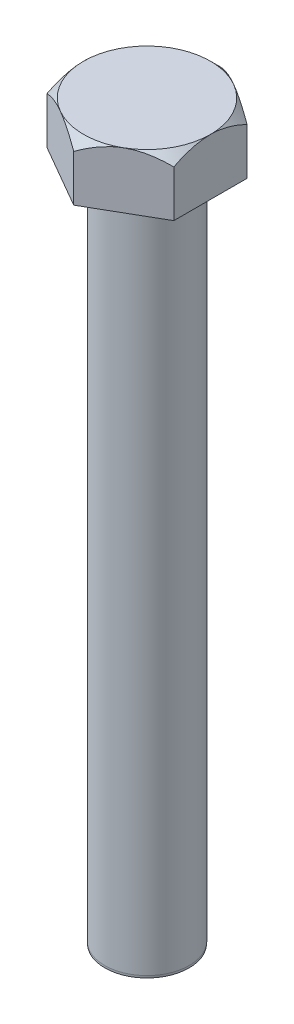
ISO-10303-21;
HEADER;
FILE_DESCRIPTION(('STEP AP214'),'2;1');
FILE_NAME('part.step','',(''),(''),'','','');
FILE_SCHEMA(('AUTOMOTIVE_DESIGN { 1 0 10303 214 1 1 1 1 }'));
ENDSEC;
DATA;
#1=APPLICATION_CONTEXT('core data for automotive mechanical design processes');
#2=APPLICATION_PROTOCOL_DEFINITION('international standard','automotive_design',2000,#1);
#3=PRODUCT_CONTEXT('',#1,'mechanical');
#4=PRODUCT('Part','Part','',(#3));
#5=PRODUCT_RELATED_PRODUCT_CATEGORY('part','',(#4));
#6=PRODUCT_DEFINITION_FORMATION('','',#4);
#7=PRODUCT_DEFINITION_CONTEXT('part definition',#1,'design');
#8=PRODUCT_DEFINITION('design','',#6,#7);
#9=PRODUCT_DEFINITION_SHAPE('','',#8);
#10=(LENGTH_UNIT() NAMED_UNIT(*) SI_UNIT(.MILLI.,.METRE.));
#11=(NAMED_UNIT(*) PLANE_ANGLE_UNIT() SI_UNIT($,.RADIAN.));
#12=(NAMED_UNIT(*) SI_UNIT($,.STERADIAN.) SOLID_ANGLE_UNIT());
#13=UNCERTAINTY_MEASURE_WITH_UNIT(LENGTH_MEASURE(1.E-05),#10,'distance_accuracy_value','');
#14=(GEOMETRIC_REPRESENTATION_CONTEXT(3) GLOBAL_UNCERTAINTY_ASSIGNED_CONTEXT((#13)) GLOBAL_UNIT_ASSIGNED_CONTEXT((#10,
#11,#12)) REPRESENTATION_CONTEXT('',''));
#15=CARTESIAN_POINT('',(0.,0.,0.));
#16=DIRECTION('',(0.,0.,1.));
#17=DIRECTION('',(1.,0.,0.));
#18=AXIS2_PLACEMENT_3D('',#15,#16,#17);
#19=CARTESIAN_POINT('',(7.15009999999996,6.35,-4.12811215973283));
#20=DIRECTION('',(-0.499999999999995,0.,0.866025403784441));
#21=DIRECTION('',(0.866025403784442,0.,0.499999999999995));
#22=AXIS2_PLACEMENT_3D('',#19,#20,#21);
#23=PLANE('',#22);
#24=CARTESIAN_POINT('',(7.15029999999996,5.24376020805829,-4.12799668967899));
#25=CARTESIAN_POINT('',(7.02735981479973,5.31473208114426,-4.19897623869856));
#26=CARTESIAN_POINT('',(6.90347465758507,5.38352591509957,-4.27050136756504));
#27=CARTESIAN_POINT('',(6.65362901516201,5.51609496244518,-4.41474981647385));
#28=CARTESIAN_POINT('',(6.52766744128796,5.57986743492815,-4.48747376505758));
#29=CARTESIAN_POINT('',(6.14521985336649,5.76320280111308,-4.70827998289497));
#30=CARTESIAN_POINT('',(5.88549626774101,5.87400155292641,-4.85823146497073));
#31=CARTESIAN_POINT('',(5.36174291484116,6.06373669034418,-5.16062060425642));
#32=CARTESIAN_POINT('',(5.09784700922402,6.14315107326227,-5.31298097640252));
#33=CARTESIAN_POINT('',(4.69766469893423,6.23501393674774,-5.54402634097325));
#34=CARTESIAN_POINT('',(4.56368142899528,6.26107948825729,-5.62138161793941));
#35=CARTESIAN_POINT('',(4.29458046497126,6.30353452510466,-5.77674713195786));
#36=CARTESIAN_POINT('',(4.15946294347778,6.319925456437,-5.85475726936435));
#37=CARTESIAN_POINT('',(3.83019852397778,6.34740730224126,-6.04485817059725));
#38=CARTESIAN_POINT('',(3.63569685436158,6.35317340265754,-6.15715376190799));
#39=CARTESIAN_POINT('',(3.24704409240871,6.34349459202812,-6.38154253864277));
#40=CARTESIAN_POINT('',(3.05289314684432,6.32804224579773,-6.49363563932778));
#41=CARTESIAN_POINT('',(2.66642169813378,6.27683739902505,-6.71676503427492));
#42=CARTESIAN_POINT('',(2.47410348685935,6.24106219749936,-6.82780000532428));
#43=CARTESIAN_POINT('',(2.09277255135678,6.15115660179108,-7.04796152358701));
#44=CARTESIAN_POINT('',(1.90375957482909,6.09702761510223,-7.15708821646561));
#45=CARTESIAN_POINT('',(1.56823093998172,5.98566881448239,-7.35080576411556));
#46=CARTESIAN_POINT('',(1.42097225552798,5.93136793728872,-7.43582560522543));
#47=CARTESIAN_POINT('',(1.12909829468736,5.81401595028394,-7.6043391150862));
#48=CARTESIAN_POINT('',(0.984483098549458,5.75096457532957,-7.68783273750533));
#49=CARTESIAN_POINT('',(0.6983516080155,5.61752492778284,-7.85303083058874));
#50=CARTESIAN_POINT('',(0.55682717595113,5.54715972840591,-7.93473999953801));
#51=CARTESIAN_POINT('',(0.276398890261677,5.40001620595466,-8.0966453457692));
#52=CARTESIAN_POINT('',(0.137493492810105,5.32324181558632,-8.17684241437976));
#53=CARTESIAN_POINT('',(-0.000199999999999894,5.24376020805829,-8.25633978951933));
#54=B_SPLINE_CURVE_WITH_KNOTS('',3,(#24,#25,#26,#27,#28,#29,#30,#31,#32,#33,#34,#35,#36,#37,#38,
#39,#40,#41,#42,#43,#44,#45,#46,#47,#48,#49,#50,#51,#52,#53),.UNSPECIFIED.,.F.,.F.,(4,2,2,2,2,2,
2,2,2,2,2,2,2,2,4),(0.,0.476107132166216,0.952472371030046,1.91034566100054,2.85300915505907,
3.32341643946382,3.7937533977268,4.46670173744884,5.13988594609707,5.81382359601269,
6.48770957546597,7.02295690652281,7.55822045931063,8.09184389327706,8.6251422671035),.UNSPECIFIED.);
#55=CARTESIAN_POINT('',(7.15009999999996,5.24387568053451,-4.12811215973283));
#56=VERTEX_POINT('',#55);
#57=CARTESIAN_POINT('',(3.57504999999996,6.35,-6.19216823959914));
#58=VERTEX_POINT('',#57);
#59=EDGE_CURVE('E105',#56,#58,#54,.T.);
#60=ORIENTED_EDGE('',*,*,#59,.F.);
#61=DIRECTION('',(0.,-1.,0.));
#62=VECTOR('',#61,1.);
#63=CARTESIAN_POINT('',(7.15009999999996,6.35,-4.12811215973283));
#64=LINE('',#63,#62);
#65=CARTESIAN_POINT('',(7.15009999999996,0.,-4.12811215973283));
#66=VERTEX_POINT('',#65);
#67=EDGE_CURVE('E272',#56,#66,#64,.T.);
#68=ORIENTED_EDGE('',*,*,#67,.T.);
#69=DIRECTION('',(-0.866025403784441,0.,-0.499999999999995));
#70=VECTOR('',#69,1.);
#71=CARTESIAN_POINT('',(7.15009999999996,0.,-4.12811215973283));
#72=LINE('',#71,#70);
#73=CARTESIAN_POINT('',(0.,0.,-8.25622431946549));
#74=VERTEX_POINT('',#73);
#75=EDGE_CURVE('E114',#66,#74,#72,.T.);
#76=ORIENTED_EDGE('',*,*,#75,.T.);
#77=DIRECTION('',(0.,-1.,0.));
#78=VECTOR('',#77,1.);
#79=CARTESIAN_POINT('',(0.,6.35,-8.25622431946549));
#80=LINE('',#79,#78);
#81=CARTESIAN_POINT('',(0.,5.24387568053451,-8.25622431946549));
#82=VERTEX_POINT('',#81);
#83=EDGE_CURVE('E132',#82,#74,#80,.T.);
#84=ORIENTED_EDGE('',*,*,#83,.F.);
#85=EDGE_CURVE('E115',#58,#82,#54,.T.);
#86=ORIENTED_EDGE('',*,*,#85,.F.);
#87=EDGE_LOOP('',(#60,#68,#76,#84,#86));
#88=FACE_BOUND('',#87,.T.);
#89=ADVANCED_FACE('F35',(#88),#23,.F.);
#90=CARTESIAN_POINT('',(0.,6.35,-8.25622431946549));
#91=DIRECTION('',(0.500000000000001,0.,0.866025403784438));
#92=DIRECTION('',(0.866025403784438,0.,-0.500000000000001));
#93=AXIS2_PLACEMENT_3D('',#90,#91,#92);
#94=PLANE('',#93);
#95=CARTESIAN_POINT('',(0.0002,5.24376020805829,-8.25633978951933));
#96=CARTESIAN_POINT('',(-0.122740185200222,5.31473208114426,-8.18536024049976));
#97=CARTESIAN_POINT('',(-0.246625342414885,5.38352591509958,-8.11383511163327));
#98=CARTESIAN_POINT('',(-0.496470984837945,5.51609496244519,-7.96958666272447));
#99=CARTESIAN_POINT('',(-0.622432558711996,5.57986743492816,-7.89686271414073));
#100=CARTESIAN_POINT('',(-1.00488014663348,5.76320280111309,-7.67605649630334));
#101=CARTESIAN_POINT('',(-1.26460373225895,5.87400155292642,-7.52610501422758));
#102=CARTESIAN_POINT('',(-1.78835708515881,6.06373669034419,-7.22371587494188));
#103=CARTESIAN_POINT('',(-2.05225299077595,6.1431510732623,-7.07135550279578));
#104=CARTESIAN_POINT('',(-2.45243530106574,6.23501393674777,-6.84031013822504));
#105=CARTESIAN_POINT('',(-2.58641857100469,6.26107948825732,-6.76295486125888));
#106=CARTESIAN_POINT('',(-2.85551953502872,6.30353452510469,-6.60758934724042));
#107=CARTESIAN_POINT('',(-2.99063705652219,6.31992545643702,-6.52957920983393));
#108=CARTESIAN_POINT('',(-3.3199014760222,6.34740730224129,-6.33947830860103));
#109=CARTESIAN_POINT('',(-3.51440314563839,6.35317340265757,-6.22718271729029));
#110=CARTESIAN_POINT('',(-3.90305590759126,6.34349459202815,-6.00279394055551));
#111=CARTESIAN_POINT('',(-4.09720685315564,6.32804224579776,-5.89070083987049));
#112=CARTESIAN_POINT('',(-4.48367830186619,6.27683739902508,-5.66757144492336));
#113=CARTESIAN_POINT('',(-4.67599651314062,6.24106219749939,-5.556536473874));
#114=CARTESIAN_POINT('',(-5.05732744864318,6.15115660179112,-5.33637495561126));
#115=CARTESIAN_POINT('',(-5.24634042517087,6.09702761510226,-5.22724826273266));
#116=CARTESIAN_POINT('',(-5.58186906001824,5.98566881448243,-5.03353071508271));
#117=CARTESIAN_POINT('',(-5.72912774447198,5.93136793728875,-4.94851087397283));
#118=CARTESIAN_POINT('',(-6.02100170531261,5.81401595028396,-4.77999736411205));
#119=CARTESIAN_POINT('',(-6.16561690145052,5.7509645753296,-4.69650374169292));
#120=CARTESIAN_POINT('',(-6.45174839198449,5.61752492778286,-4.5313056486095));
#121=CARTESIAN_POINT('',(-6.59327282404887,5.54715972840593,-4.44959647966022));
#122=CARTESIAN_POINT('',(-6.87370110973833,5.40001620595466,-4.28769113342903));
#123=CARTESIAN_POINT('',(-7.0126065071899,5.32324181558632,-4.20749406481847));
#124=CARTESIAN_POINT('',(-7.15030000000001,5.24376020805829,-4.12799668967889));
#125=B_SPLINE_CURVE_WITH_KNOTS('',3,(#95,#96,#97,#98,#99,#100,#101,#102,#103,#104,#105,#106,
#107,#108,#109,#110,#111,#112,#113,#114,#115,#116,#117,#118,#119,#120,#121,#122,#123,#124),
.UNSPECIFIED.,.F.,.F.,(4,2,2,2,2,2,2,2,2,2,2,2,2,2,4),(0.,0.476107132166221,0.952472371030056,
1.91034566100056,2.85300915505911,3.32341643946385,3.79375339772684,4.46670173744889,
5.13988594609711,5.81382359601273,6.48770957546601,7.02295690652286,7.55822045931071,
8.09184389327715,8.62514226710361),.UNSPECIFIED.);
#126=CARTESIAN_POINT('',(-3.57505000000001,6.35,-6.19216823959911));
#127=VERTEX_POINT('',#126);
#128=EDGE_CURVE('E122',#82,#127,#125,.T.);
#129=ORIENTED_EDGE('',*,*,#128,.F.);
#130=ORIENTED_EDGE('',*,*,#83,.T.);
#131=DIRECTION('',(-0.866025403784438,0.,0.500000000000001));
#132=VECTOR('',#131,1.);
#133=CARTESIAN_POINT('',(0.,0.,-8.25622431946549));
#134=LINE('',#133,#132);
#135=CARTESIAN_POINT('',(-7.15010000000001,0.,-4.12811215973273));
#136=VERTEX_POINT('',#135);
#137=EDGE_CURVE('E263',#74,#136,#134,.T.);
#138=ORIENTED_EDGE('',*,*,#137,.T.);
#139=DIRECTION('',(0.,-1.,0.));
#140=VECTOR('',#139,1.);
#141=CARTESIAN_POINT('',(-7.15010000000001,6.35,-4.12811215973273));
#142=LINE('',#141,#140);
#143=CARTESIAN_POINT('',(-7.15010000000001,5.24387568053451,-4.12811215973273));
#144=VERTEX_POINT('',#143);
#145=EDGE_CURVE('E205',#144,#136,#142,.T.);
#146=ORIENTED_EDGE('',*,*,#145,.F.);
#147=EDGE_CURVE('E133',#127,#144,#125,.T.);
#148=ORIENTED_EDGE('',*,*,#147,.F.);
#149=EDGE_LOOP('',(#129,#130,#138,#146,#148));
#150=FACE_BOUND('',#149,.T.);
#151=ADVANCED_FACE('F193',(#150),#94,.F.);
#152=CARTESIAN_POINT('',(-7.15010000000001,6.35,-4.12811215973273));
#153=DIRECTION('',(1.,0.,0.));
#154=DIRECTION('',(0.,0.,-1.));
#155=AXIS2_PLACEMENT_3D('',#152,#153,#154);
#156=PLANE('',#155);
#157=CARTESIAN_POINT('',(-7.15010000000003,1.63089085788719,-9.47386909605649));
#158=CARTESIAN_POINT('',(-7.15010000000003,1.81121581560539,-9.24790249070521));
#159=CARTESIAN_POINT('',(-7.15010000000003,1.99016418725543,-9.02082114931031));
#160=CARTESIAN_POINT('',(-7.15010000000003,2.34465316669975,-8.56394073706759));
#161=CARTESIAN_POINT('',(-7.15010000000003,2.5201930563962,-8.33414110959574));
#162=CARTESIAN_POINT('',(-7.15010000000003,2.868446395647,-7.86968034981608));
#163=CARTESIAN_POINT('',(-7.15010000000003,3.0411284373893,-7.63499559658916));
#164=CARTESIAN_POINT('',(-7.15010000000002,3.38131039804522,-7.16191403046406));
#165=CARTESIAN_POINT('',(-7.15010000000002,3.54881066036877,-6.92351746513816));
#166=CARTESIAN_POINT('',(-7.15010000000002,3.89019859321875,-6.42356671095031));
#167=CARTESIAN_POINT('',(-7.15010000000002,4.06356649358224,-6.16165586234294));
#168=CARTESIAN_POINT('',(-7.15010000000002,4.40077381694092,-5.63166319550724));
#169=CARTESIAN_POINT('',(-7.15010000000002,4.56461143837196,-5.36358022380933));
#170=CARTESIAN_POINT('',(-7.15010000000002,4.87937516438839,-4.82096243326766));
#171=CARTESIAN_POINT('',(-7.15010000000002,5.03033869234989,-4.54644949317194));
#172=CARTESIAN_POINT('',(-7.15010000000001,5.31597281014485,-3.98913965325442));
#173=CARTESIAN_POINT('',(-7.15010000000001,5.45065169434768,-3.70634706251455));
#174=CARTESIAN_POINT('',(-7.15010000000001,5.68224395499392,-3.16946720873966));
#175=CARTESIAN_POINT('',(-7.15010000000001,5.78179628197522,-2.91652981738955));
#176=CARTESIAN_POINT('',(-7.15010000000001,5.96068130805078,-2.40346766112692));
#177=CARTESIAN_POINT('',(-7.15010000000001,6.04001286165642,-2.14334248995796));
#178=CARTESIAN_POINT('',(-7.1501,6.17245096820923,-1.62248495464225));
#179=CARTESIAN_POINT('',(-7.1501,6.22609680418521,-1.36189223637387));
#180=CARTESIAN_POINT('',(-7.1501,6.30590762943054,-0.836507861915944));
#181=CARTESIAN_POINT('',(-7.1501,6.33208104018206,-0.571717517759924));
#182=CARTESIAN_POINT('',(-7.1501,6.35408284405149,-0.0577187353176461));
#183=CARTESIAN_POINT('',(-7.1501,6.35173239837544,0.19141159314656));
#184=CARTESIAN_POINT('',(-7.1501,6.32124800606946,0.688077635906895));
#185=CARTESIAN_POINT('',(-7.1501,6.29311214694111,0.935613230550542));
#186=CARTESIAN_POINT('',(-7.15009999999999,6.21229082442829,1.43154670462864));
#187=CARTESIAN_POINT('',(-7.15009999999999,6.15913527095504,1.6798664946589));
#188=CARTESIAN_POINT('',(-7.15009999999999,6.03147971556139,2.17085918647798));
#189=CARTESIAN_POINT('',(-7.15009999999999,5.9569795257941,2.4135320385497));
#190=CARTESIAN_POINT('',(-7.15009999999999,5.79048248965085,2.89215321636684));
#191=CARTESIAN_POINT('',(-7.15009999999999,5.69852189244993,3.12811432942166));
#192=CARTESIAN_POINT('',(-7.15009999999999,5.50032506783947,3.59401612680425));
#193=CARTESIAN_POINT('',(-7.15009999999999,5.39408271156479,3.8239541754974));
#194=CARTESIAN_POINT('',(-7.15009999999998,5.16984050461004,4.27885242834733));
#195=CARTESIAN_POINT('',(-7.15009999999998,5.05180562125056,4.50379521875785));
#196=CARTESIAN_POINT('',(-7.15009999999998,4.80656023664318,4.94854616944678));
#197=CARTESIAN_POINT('',(-7.15009999999998,4.67935108776111,5.168355080205));
#198=CARTESIAN_POINT('',(-7.15009999999998,4.42401096856745,5.59273981639913));
#199=CARTESIAN_POINT('',(-7.15009999999998,4.29623669089792,5.79753139755686));
#200=CARTESIAN_POINT('',(-7.15009999999998,4.03519862932643,6.20359582585859));
#201=CARTESIAN_POINT('',(-7.15009999999998,3.90193444245225,6.4048684131501));
#202=CARTESIAN_POINT('',(-7.15009999999998,3.63195773249821,6.80275896707806));
#203=CARTESIAN_POINT('',(-7.15009999999998,3.49528075722348,6.9994011408559));
#204=CARTESIAN_POINT('',(-7.15009999999997,3.21822330604325,7.38998078224734));
#205=CARTESIAN_POINT('',(-7.15009999999997,3.0778438588743,7.58391897874123));
#206=CARTESIAN_POINT('',(-7.15009999999997,2.93594735354651,7.77672110388246));
#207=B_SPLINE_CURVE_WITH_KNOTS('',3,(#157,#158,#159,#160,#161,#162,#163,#164,#165,#166,#167,
#168,#169,#170,#171,#172,#173,#174,#175,#176,#177,#178,#179,#180,#181,#182,#183,#184,#185,#186,
#187,#188,#189,#190,#191,#192,#193,#194,#195,#196,#197,#198,#199,#200,#201,#202,#203,#204,#205,
#206),.UNSPECIFIED.,.F.,.F.,(4,2,2,2,2,2,2,2,2,2,2,2,2,2,2,2,2,2,2,2,2,2,2,2,4),(0.,
0.867309176171177,1.73479913643537,2.60884845848508,3.48283973039317,4.42495432930787,
5.36724644671029,6.30669878036595,7.24567058249782,8.06046150623437,8.87529857688988,
9.67218308312768,10.4688232385201,11.214882925787,11.9609979526155,12.7217281313764,
13.4824650052708,14.2416394652586,15.0011407631884,15.7629695239043,16.524686213128,
17.248733545678,17.9728341200296,18.6912157430264,19.4093998229271),.UNSPECIFIED.);
#208=CARTESIAN_POINT('',(-7.1501,6.35,0.));
#209=VERTEX_POINT('',#208);
#210=EDGE_CURVE('E187',#144,#209,#207,.T.);
#211=ORIENTED_EDGE('',*,*,#210,.F.);
#212=ORIENTED_EDGE('',*,*,#145,.T.);
#213=DIRECTION('',(0.,0.,1.));
#214=VECTOR('',#213,1.);
#215=CARTESIAN_POINT('',(-7.15010000000001,0.,-4.12811215973273));
#216=LINE('',#215,#214);
#217=CARTESIAN_POINT('',(-7.15009999999999,0.,4.12811215973278));
#218=VERTEX_POINT('',#217);
#219=EDGE_CURVE('E222',#136,#218,#216,.T.);
#220=ORIENTED_EDGE('',*,*,#219,.T.);
#221=DIRECTION('',(0.,-1.,0.));
#222=VECTOR('',#221,1.);
#223=CARTESIAN_POINT('',(-7.15009999999999,6.35,4.12811215973278));
#224=LINE('',#223,#222);
#225=CARTESIAN_POINT('',(-7.15009999999999,5.24387568053451,4.12811215973278));
#226=VERTEX_POINT('',#225);
#227=EDGE_CURVE('E220',#226,#218,#224,.T.);
#228=ORIENTED_EDGE('',*,*,#227,.F.);
#229=EDGE_CURVE('E181',#209,#226,#207,.T.);
#230=ORIENTED_EDGE('',*,*,#229,.F.);
#231=EDGE_LOOP('',(#211,#212,#220,#228,#230));
#232=FACE_BOUND('',#231,.T.);
#233=ADVANCED_FACE('F189',(#232),#156,.F.);
#234=CARTESIAN_POINT('',(-7.15009999999999,6.35,4.12811215973278));
#235=DIRECTION('',(0.499999999999995,0.,-0.866025403784441));
#236=DIRECTION('',(-0.866025403784441,0.,-0.499999999999995));
#237=AXIS2_PLACEMENT_3D('',#234,#235,#236);
#238=PLANE('',#237);
#239=CARTESIAN_POINT('',(-7.15029999999998,5.24376020805829,4.12799668967894));
#240=CARTESIAN_POINT('',(-7.02735981479976,5.31473208114426,4.19897623869851));
#241=CARTESIAN_POINT('',(-6.9034746575851,5.38352591509958,4.27050136756499));
#242=CARTESIAN_POINT('',(-6.65362901516204,5.51609496244519,4.4147498164738));
#243=CARTESIAN_POINT('',(-6.52766744128798,5.57986743492816,4.48747376505753));
#244=CARTESIAN_POINT('',(-6.1452198533665,5.76320280111309,4.70827998289492));
#245=CARTESIAN_POINT('',(-5.88549626774103,5.87400155292642,4.85823146497068));
#246=CARTESIAN_POINT('',(-5.36174291484117,6.06373669034419,5.16062060425638));
#247=CARTESIAN_POINT('',(-5.09784700922402,6.1431510732623,5.31298097640248));
#248=CARTESIAN_POINT('',(-4.69766469893423,6.23501393674777,5.54402634097321));
#249=CARTESIAN_POINT('',(-4.56368142899528,6.26107948825732,5.62138161793937));
#250=CARTESIAN_POINT('',(-4.29458046497126,6.30353452510469,5.77674713195783));
#251=CARTESIAN_POINT('',(-4.15946294347778,6.31992545643702,5.85475726936432));
#252=CARTESIAN_POINT('',(-3.83019852397777,6.34740730224129,6.04485817059721));
#253=CARTESIAN_POINT('',(-3.63569685436158,6.35317340265757,6.15715376190795));
#254=CARTESIAN_POINT('',(-3.24704409240871,6.34349459202815,6.38154253864273));
#255=CARTESIAN_POINT('',(-3.05289314684433,6.32804224579776,6.49363563932775));
#256=CARTESIAN_POINT('',(-2.66642169813378,6.27683739902508,6.71676503427488));
#257=CARTESIAN_POINT('',(-2.47410348685935,6.24106219749939,6.82780000532424));
#258=CARTESIAN_POINT('',(-2.09277255135678,6.15115660179112,7.04796152358698));
#259=CARTESIAN_POINT('',(-1.90375957482909,6.09702761510226,7.15708821646557));
#260=CARTESIAN_POINT('',(-1.56823093998172,5.98566881448243,7.35080576411552));
#261=CARTESIAN_POINT('',(-1.42097225552798,5.93136793728875,7.4358256052254));
#262=CARTESIAN_POINT('',(-1.12909829468735,5.81401595028396,7.60433911508618));
#263=CARTESIAN_POINT('',(-0.984483098549436,5.7509645753296,7.68783273750531));
#264=CARTESIAN_POINT('',(-0.698351608015466,5.61752492778286,7.85303083058873));
#265=CARTESIAN_POINT('',(-0.556827175951092,5.54715972840593,7.934739999538));
#266=CARTESIAN_POINT('',(-0.276398890261629,5.40001620595466,8.0966453457692));
#267=CARTESIAN_POINT('',(-0.137493492810052,5.32324181558632,8.17684241437975));
#268=CARTESIAN_POINT('',(0.000200000000057124,5.24376020805829,8.25633978951933));
#269=B_SPLINE_CURVE_WITH_KNOTS('',3,(#239,#240,#241,#242,#243,#244,#245,#246,#247,#248,#249,
#250,#251,#252,#253,#254,#255,#256,#257,#258,#259,#260,#261,#262,#263,#264,#265,#266,#267,#268),
.UNSPECIFIED.,.F.,.F.,(4,2,2,2,2,2,2,2,2,2,2,2,2,2,4),(0.,0.476107132166221,0.952472371030058,
1.91034566100057,2.85300915505911,3.32341643946385,3.79375339772684,4.46670173744888,
5.13988594609711,5.81382359601273,6.48770957546601,7.02295690652286,7.55822045931071,
8.09184389327715,8.62514226710361),.UNSPECIFIED.);
#270=CARTESIAN_POINT('',(-3.57504999999996,6.35,6.19216823959913));
#271=VERTEX_POINT('',#270);
#272=EDGE_CURVE('E188',#226,#271,#269,.T.);
#273=ORIENTED_EDGE('',*,*,#272,.F.);
#274=ORIENTED_EDGE('',*,*,#227,.T.);
#275=DIRECTION('',(0.866025403784441,0.,0.499999999999995));
#276=VECTOR('',#275,1.);
#277=CARTESIAN_POINT('',(-7.15009999999999,0.,4.12811215973278));
#278=LINE('',#277,#276);
#279=CARTESIAN_POINT('',(0.,0.,8.25622431946549));
#280=VERTEX_POINT('',#279);
#281=EDGE_CURVE('E264',#218,#280,#278,.T.);
#282=ORIENTED_EDGE('',*,*,#281,.T.);
#283=DIRECTION('',(0.,-1.,0.));
#284=VECTOR('',#283,1.);
#285=CARTESIAN_POINT('',(0.,6.35,8.25622431946549));
#286=LINE('',#285,#284);
#287=CARTESIAN_POINT('',(0.,5.24387568053451,8.25622431946549));
#288=VERTEX_POINT('',#287);
#289=EDGE_CURVE('E226',#288,#280,#286,.T.);
#290=ORIENTED_EDGE('',*,*,#289,.F.);
#291=EDGE_CURVE('E175',#271,#288,#269,.T.);
#292=ORIENTED_EDGE('',*,*,#291,.F.);
#293=EDGE_LOOP('',(#273,#274,#282,#290,#292));
#294=FACE_BOUND('',#293,.T.);
#295=ADVANCED_FACE('F192',(#294),#238,.F.);
#296=CARTESIAN_POINT('',(0.,6.35,8.25622431946549));
#297=DIRECTION('',(-0.500000000000007,0.,-0.866025403784435));
#298=DIRECTION('',(-0.866025403784435,0.,0.500000000000007));
#299=AXIS2_PLACEMENT_3D('',#296,#297,#298);
#300=PLANE('',#299);
#301=CARTESIAN_POINT('',(-0.000199999999942347,5.24376020805829,8.25633978951933));
#302=CARTESIAN_POINT('',(0.122740185200279,5.31473208114426,8.18536024049976));
#303=CARTESIAN_POINT('',(0.246625342414941,5.38352591509958,8.11383511163327));
#304=CARTESIAN_POINT('',(0.496470984838001,5.51609496244519,7.96958666272446));
#305=CARTESIAN_POINT('',(0.622432558712051,5.57986743492816,7.89686271414073));
#306=CARTESIAN_POINT('',(1.00488014663353,5.76320280111309,7.67605649630334));
#307=CARTESIAN_POINT('',(1.264603732259,5.87400155292642,7.52610501422757));
#308=CARTESIAN_POINT('',(1.78835708515886,6.06373669034419,7.22371587494186));
#309=CARTESIAN_POINT('',(2.052252990776,6.1431510732623,7.07135550279576));
#310=CARTESIAN_POINT('',(2.45243530106579,6.23501393674777,6.84031013822502));
#311=CARTESIAN_POINT('',(2.58641857100474,6.26107948825731,6.76295486125886));
#312=CARTESIAN_POINT('',(2.85551953502876,6.30353452510469,6.6075893472404));
#313=CARTESIAN_POINT('',(2.99063705652223,6.31992545643702,6.52957920983391));
#314=CARTESIAN_POINT('',(3.31990147602224,6.34740730224129,6.33947830860101));
#315=CARTESIAN_POINT('',(3.51440314563843,6.35317340265757,6.22718271729027));
#316=CARTESIAN_POINT('',(3.9030559075913,6.34349459202815,6.00279394055549));
#317=CARTESIAN_POINT('',(4.09720685315568,6.32804224579776,5.89070083987047));
#318=CARTESIAN_POINT('',(4.48367830186623,6.27683739902508,5.66757144492333));
#319=CARTESIAN_POINT('',(4.67599651314065,6.24106219749939,5.55653647387397));
#320=CARTESIAN_POINT('',(5.05732744864322,6.15115660179112,5.33637495561122));
#321=CARTESIAN_POINT('',(5.24634042517091,6.09702761510226,5.22724826273263));
#322=CARTESIAN_POINT('',(5.58186906001828,5.98566881448243,5.03353071508267));
#323=CARTESIAN_POINT('',(5.72912774447202,5.93136793728875,4.94851087397279));
#324=CARTESIAN_POINT('',(6.02100170531265,5.81401595028396,4.77999736411201));
#325=CARTESIAN_POINT('',(6.16561690145056,5.7509645753296,4.69650374169287));
#326=CARTESIAN_POINT('',(6.45174839198452,5.61752492778285,4.53130564860946));
#327=CARTESIAN_POINT('',(6.5932728240489,5.54715972840592,4.44959647966018));
#328=CARTESIAN_POINT('',(6.87370110973836,5.40001620595466,4.28769113342898));
#329=CARTESIAN_POINT('',(7.01260650718993,5.32324181558632,4.20749406481842));
#330=CARTESIAN_POINT('',(7.15030000000004,5.24376020805829,4.12799668967884));
#331=B_SPLINE_CURVE_WITH_KNOTS('',3,(#301,#302,#303,#304,#305,#306,#307,#308,#309,#310,#311,
#312,#313,#314,#315,#316,#317,#318,#319,#320,#321,#322,#323,#324,#325,#326,#327,#328,#329,#330),
.UNSPECIFIED.,.F.,.F.,(4,2,2,2,2,2,2,2,2,2,2,2,2,2,4),(0.,0.476107132166222,0.952472371030056,
1.91034566100056,2.8530091550591,3.32341643946385,3.79375339772684,4.46670173744888,
5.13988594609711,5.81382359601273,6.48770957546601,7.02295690652286,7.55822045931071,
8.09184389327715,8.62514226710361),.UNSPECIFIED.);
#332=CARTESIAN_POINT('',(3.57505000000005,6.35,6.19216823959909));
#333=VERTEX_POINT('',#332);
#334=EDGE_CURVE('E283',#288,#333,#331,.T.);
#335=ORIENTED_EDGE('',*,*,#334,.F.);
#336=ORIENTED_EDGE('',*,*,#289,.T.);
#337=DIRECTION('',(0.866025403784435,0.,-0.500000000000007));
#338=VECTOR('',#337,1.);
#339=CARTESIAN_POINT('',(0.,0.,8.25622431946549));
#340=LINE('',#339,#338);
#341=CARTESIAN_POINT('',(7.15010000000004,0.,4.12811215973268));
#342=VERTEX_POINT('',#341);
#343=EDGE_CURVE('E268',#280,#342,#340,.T.);
#344=ORIENTED_EDGE('',*,*,#343,.T.);
#345=DIRECTION('',(0.,-1.,0.));
#346=VECTOR('',#345,1.);
#347=CARTESIAN_POINT('',(7.15010000000004,6.35,4.12811215973268));
#348=LINE('',#347,#346);
#349=CARTESIAN_POINT('',(7.15010000000004,5.24387568053451,4.12811215973268));
#350=VERTEX_POINT('',#349);
#351=EDGE_CURVE('E229',#350,#342,#348,.T.);
#352=ORIENTED_EDGE('',*,*,#351,.F.);
#353=EDGE_CURVE('E167',#333,#350,#331,.T.);
#354=ORIENTED_EDGE('',*,*,#353,.F.);
#355=EDGE_LOOP('',(#335,#336,#344,#352,#354));
#356=FACE_BOUND('',#355,.T.);
#357=ADVANCED_FACE('F280',(#356),#300,.F.);
#358=CARTESIAN_POINT('',(7.15010000000004,6.35,4.12811215973268));
#359=DIRECTION('',(-1.,0.,0.));
#360=DIRECTION('',(0.,0.,1.));
#361=AXIS2_PLACEMENT_3D('',#358,#359,#360);
#362=PLANE('',#361);
#363=CARTESIAN_POINT('',(7.1500999999999,1.63089084568141,-9.47386911134843));
#364=CARTESIAN_POINT('',(7.1500999999999,1.8112158038748,-9.24790250553399));
#365=CARTESIAN_POINT('',(7.15009999999991,1.9901641759994,-9.02082116367475));
#366=CARTESIAN_POINT('',(7.15009999999991,2.34465315639033,-8.56394075049952));
#367=CARTESIAN_POINT('',(7.15009999999991,2.52019304655884,-8.33414112255949));
#368=CARTESIAN_POINT('',(7.15009999999992,2.86844638675769,-7.86968036182892));
#369=CARTESIAN_POINT('',(7.15009999999992,3.04112842897584,-7.63499560811917));
#370=CARTESIAN_POINT('',(7.15009999999992,3.38131039057672,-7.16191404102097));
#371=CARTESIAN_POINT('',(7.15009999999993,3.54881065336935,-6.92351747520483));
#372=CARTESIAN_POINT('',(7.15009999999993,3.89019858720553,-6.42356671995492));
#373=CARTESIAN_POINT('',(7.15009999999994,4.06356648808435,-6.16165587077427));
#374=CARTESIAN_POINT('',(7.15009999999994,4.40077381245204,-5.63166320277258));
#375=CARTESIAN_POINT('',(7.15009999999994,4.56461143437675,-5.36358023048195));
#376=CARTESIAN_POINT('',(7.15009999999995,4.87937516134173,-4.82096243873408));
#377=CARTESIAN_POINT('',(7.15009999999995,5.03033868975839,-4.54644949802505));
#378=CARTESIAN_POINT('',(7.15009999999996,5.31597280840798,-3.98913965684663));
#379=CARTESIAN_POINT('',(7.15009999999996,5.45065169301035,-3.7063470654592));
#380=CARTESIAN_POINT('',(7.15009999999997,5.68224395389446,-3.16946721142345));
#381=CARTESIAN_POINT('',(7.15009999999997,5.7817962807887,-2.91652982049303));
#382=CARTESIAN_POINT('',(7.15009999999997,5.96068130677324,-2.40346766509055));
#383=CARTESIAN_POINT('',(7.15009999999998,6.04001286037489,-2.14334249436203));
#384=CARTESIAN_POINT('',(7.15009999999998,6.17245096702639,-1.62248495991549));
#385=CARTESIAN_POINT('',(7.15009999999999,6.22609680310152,-1.36189224207524));
#386=CARTESIAN_POINT('',(7.15009999999999,6.30590762865255,-0.836507868466953));
#387=CARTESIAN_POINT('',(7.15009999999999,6.33208103961055,-0.571717524732427));
#388=CARTESIAN_POINT('',(7.1501,6.35408284398224,-0.057718742911977));
#389=CARTESIAN_POINT('',(7.1501,6.35173239857837,0.191411585350977));
#390=CARTESIAN_POINT('',(7.15010000000001,6.32124800684642,0.688077627739453));
#391=CARTESIAN_POINT('',(7.15010000000001,6.29311214801996,0.935613222212498));
#392=CARTESIAN_POINT('',(7.15010000000001,6.2122908261277,1.43154669595436));
#393=CARTESIAN_POINT('',(7.15010000000002,6.15913527297532,1.67986648581989));
#394=CARTESIAN_POINT('',(7.15010000000002,6.03147971821725,2.17085917733268));
#395=CARTESIAN_POINT('',(7.15010000000002,5.95697952876465,2.41353202926283));
#396=CARTESIAN_POINT('',(7.15010000000003,5.79048249349503,2.89215320606262));
#397=CARTESIAN_POINT('',(7.15010000000003,5.69852189690814,3.12811431826103));
#398=CARTESIAN_POINT('',(7.15010000000004,5.50032507358712,3.59401611397431));
#399=CARTESIAN_POINT('',(7.15010000000004,5.39408271798793,3.82395416185457));
#400=CARTESIAN_POINT('',(7.15010000000004,5.16984051242519,4.27885241310805));
#401=CARTESIAN_POINT('',(7.15010000000005,5.05180562978249,4.50379520273518));
#402=CARTESIAN_POINT('',(7.15010000000005,4.80656024663132,4.94854615188308));
#403=CARTESIAN_POINT('',(7.15010000000005,4.67935109848869,5.16835506188367));
#404=CARTESIAN_POINT('',(7.15010000000006,4.42401098069604,5.59273979670796));
#405=CARTESIAN_POINT('',(7.15010000000006,4.29623670368454,5.79753137725083));
#406=CARTESIAN_POINT('',(7.15010000000007,4.03519864343176,6.20359580433172));
#407=CARTESIAN_POINT('',(7.15010000000007,3.90193445721827,6.40486839101724));
#408=CARTESIAN_POINT('',(7.15010000000007,3.63195774857802,6.80275894374802));
#409=CARTESIAN_POINT('',(7.15010000000007,3.49528077395631,6.99940111693457));
#410=CARTESIAN_POINT('',(7.15010000000008,3.21822332408119,7.38998075714733));
#411=CARTESIAN_POINT('',(7.15010000000008,3.07784387756432,7.58391895305384));
#412=CARTESIAN_POINT('',(7.15010000000008,2.93594737288767,7.7767210776087));
#413=B_SPLINE_CURVE_WITH_KNOTS('',3,(#363,#364,#365,#366,#367,#368,#369,#370,#371,#372,#373,
#374,#375,#376,#377,#378,#379,#380,#381,#382,#383,#384,#385,#386,#387,#388,#389,#390,#391,#392,
#393,#394,#395,#396,#397,#398,#399,#400,#401,#402,#403,#404,#405,#406,#407,#408,#409,#410,#411,
#412),.UNSPECIFIED.,.F.,.F.,(4,2,2,2,2,2,2,2,2,2,2,2,2,2,2,2,2,2,2,2,2,2,2,2,4),(0.,
0.867309178146457,1.7347991403865,2.60884846444894,3.4828397383694,4.42495433957124,
5.36724645926233,6.30669879518682,7.24567059958342,8.06046152205712,8.87529859145194,
9.67218309649984,10.468823250704,11.2148829373626,11.9609979635813,12.7217281416573,
13.4824650148672,14.2416394717964,15.001140766664,15.7629695243005,16.524686210446,
17.248733540386,17.9728341121274,18.6912157325493,19.4093998098754),.UNSPECIFIED.);
#414=CARTESIAN_POINT('',(7.1501,6.35,0.));
#415=VERTEX_POINT('',#414);
#416=EDGE_CURVE('E276',#350,#415,#413,.F.);
#417=ORIENTED_EDGE('',*,*,#416,.F.);
#418=ORIENTED_EDGE('',*,*,#351,.T.);
#419=DIRECTION('',(0.,0.,-1.));
#420=VECTOR('',#419,1.);
#421=CARTESIAN_POINT('',(7.15010000000004,0.,4.12811215973268));
#422=LINE('',#421,#420);
#423=EDGE_CURVE('E262',#342,#66,#422,.T.);
#424=ORIENTED_EDGE('',*,*,#423,.T.);
#425=ORIENTED_EDGE('',*,*,#67,.F.);
#426=EDGE_CURVE('E110',#415,#56,#413,.F.);
#427=ORIENTED_EDGE('',*,*,#426,.F.);
#428=EDGE_LOOP('',(#417,#418,#424,#425,#427));
#429=FACE_BOUND('',#428,.T.);
#430=ADVANCED_FACE('F256',(#429),#362,.F.);
#431=CARTESIAN_POINT('',(0.,0.,0.));
#432=DIRECTION('',(0.,1.,0.));
#433=DIRECTION('',(0.,0.,1.));
#434=AXIS2_PLACEMENT_3D('',#431,#432,#433);
#435=PLANE('',#434);
#436=CARTESIAN_POINT('',(0.,0.,0.));
#437=DIRECTION('',(0.,1.,0.));
#438=DIRECTION('',(0.,0.,1.));
#439=AXIS2_PLACEMENT_3D('',#436,#437,#438);
#440=CIRCLE('',#439,4.7625);
#441=CARTESIAN_POINT('',(0.,0.,4.7625));
#442=VERTEX_POINT('',#441);
#443=EDGE_CURVE('E234',#442,#442,#440,.F.);
#444=ORIENTED_EDGE('',*,*,#443,.F.);
#445=EDGE_LOOP('',(#444));
#446=FACE_BOUND('',#445,.T.);
#447=ORIENTED_EDGE('',*,*,#75,.F.);
#448=ORIENTED_EDGE('',*,*,#423,.F.);
#449=ORIENTED_EDGE('',*,*,#343,.F.);
#450=ORIENTED_EDGE('',*,*,#281,.F.);
#451=ORIENTED_EDGE('',*,*,#219,.F.);
#452=ORIENTED_EDGE('',*,*,#137,.F.);
#453=EDGE_LOOP('',(#447,#448,#449,#450,#451,#452));
#454=FACE_BOUND('',#453,.T.);
#455=ADVANCED_FACE('F251',(#446,#454),#435,.F.);
#456=CARTESIAN_POINT('',(0.,-76.2,0.));
#457=DIRECTION('',(0.,1.,0.));
#458=DIRECTION('',(0.,0.,1.));
#459=AXIS2_PLACEMENT_3D('',#456,#457,#458);
#460=CYLINDRICAL_SURFACE('',#459,4.7625);
#461=CARTESIAN_POINT('',(0.,-75.946000000004,0.));
#462=DIRECTION('',(0.,-1.,0.));
#463=DIRECTION('',(0.,0.,-1.));
#464=AXIS2_PLACEMENT_3D('',#461,#462,#463);
#465=CIRCLE('',#464,4.7625);
#466=CARTESIAN_POINT('',(0.,-75.946000000004,4.7625));
#467=VERTEX_POINT('',#466);
#468=EDGE_CURVE('E12',#467,#467,#465,.F.);
#469=CARTESIAN_POINT('',(0.,-75.946000000004,4.7625));
#470=CARTESIAN_POINT('',(0.,-75.1548958333373,4.7625));
#471=CARTESIAN_POINT('',(0.,-74.3637916666706,4.7625));
#472=CARTESIAN_POINT('',(0.,-72.7815833333372,4.7625));
#473=CARTESIAN_POINT('',(0.,-71.9904791666705,4.7625));
#474=CARTESIAN_POINT('',(0.,-70.408270833337,4.7625));
#475=CARTESIAN_POINT('',(0.,-69.6171666666703,4.7625));
#476=CARTESIAN_POINT('',(0.,-68.0349583333369,4.7625));
#477=CARTESIAN_POINT('',(0.,-67.2438541666702,4.7625));
#478=CARTESIAN_POINT('',(0.,-65.6616458333368,4.7625));
#479=CARTESIAN_POINT('',(0.,-64.8705416666701,4.7625));
#480=CARTESIAN_POINT('',(0.,-63.2883333333367,4.7625));
#481=CARTESIAN_POINT('',(0.,-62.49722916667,4.7625));
#482=CARTESIAN_POINT('',(0.,-60.9150208333365,4.7625));
#483=CARTESIAN_POINT('',(0.,-60.1239166666698,4.7625));
#484=CARTESIAN_POINT('',(0.,-58.5417083333364,4.7625));
#485=CARTESIAN_POINT('',(0.,-57.7506041666697,4.7625));
#486=CARTESIAN_POINT('',(0.,-56.1683958333363,4.7625));
#487=CARTESIAN_POINT('',(0.,-55.3772916666696,4.7625));
#488=CARTESIAN_POINT('',(0.,-53.7950833333362,4.7625));
#489=CARTESIAN_POINT('',(0.,-53.0039791666695,4.7625));
#490=CARTESIAN_POINT('',(0.,-51.421770833336,4.7625));
#491=CARTESIAN_POINT('',(0.,-50.6306666666693,4.7625));
#492=CARTESIAN_POINT('',(0.,-49.0484583333359,4.7625));
#493=CARTESIAN_POINT('',(0.,-48.2573541666692,4.7625));
#494=CARTESIAN_POINT('',(0.,-46.6751458333358,4.7625));
#495=CARTESIAN_POINT('',(0.,-45.8840416666691,4.7625));
#496=CARTESIAN_POINT('',(0.,-44.3018333333357,4.7625));
#497=CARTESIAN_POINT('',(0.,-43.510729166669,4.7625));
#498=CARTESIAN_POINT('',(0.,-41.9285208333355,4.7625));
#499=CARTESIAN_POINT('',(0.,-41.1374166666688,4.7625));
#500=CARTESIAN_POINT('',(0.,-39.5552083333354,4.7625));
#501=CARTESIAN_POINT('',(0.,-38.7641041666687,4.7625));
#502=CARTESIAN_POINT('',(0.,-37.1818958333353,4.7625));
#503=CARTESIAN_POINT('',(0.,-36.3907916666686,4.7625));
#504=CARTESIAN_POINT('',(0.,-34.8085833333352,4.7625));
#505=CARTESIAN_POINT('',(0.,-34.0174791666685,4.7625));
#506=CARTESIAN_POINT('',(0.,-32.435270833335,4.7625));
#507=CARTESIAN_POINT('',(0.,-31.6441666666683,4.7625));
#508=CARTESIAN_POINT('',(0.,-30.0619583333349,4.7625));
#509=CARTESIAN_POINT('',(0.,-29.2708541666682,4.7625));
#510=CARTESIAN_POINT('',(0.,-27.6886458333348,4.7625));
#511=CARTESIAN_POINT('',(0.,-26.8975416666681,4.7625));
#512=CARTESIAN_POINT('',(0.,-25.3153333333347,4.7625));
#513=CARTESIAN_POINT('',(0.,-24.524229166668,4.7625));
#514=CARTESIAN_POINT('',(0.,-22.9420208333345,4.7625));
#515=CARTESIAN_POINT('',(0.,-22.1509166666678,4.7625));
#516=CARTESIAN_POINT('',(0.,-20.5687083333344,4.7625));
#517=CARTESIAN_POINT('',(0.,-19.7776041666677,4.7625));
#518=CARTESIAN_POINT('',(0.,-18.1953958333343,4.7625));
#519=CARTESIAN_POINT('',(0.,-17.4042916666676,4.7625));
#520=CARTESIAN_POINT('',(0.,-15.8220833333342,4.7625));
#521=CARTESIAN_POINT('',(0.,-15.0309791666675,4.7625));
#522=CARTESIAN_POINT('',(0.,-13.448770833334,4.7625));
#523=CARTESIAN_POINT('',(0.,-12.6576666666673,4.7625));
#524=CARTESIAN_POINT('',(0.,-11.0754583333339,4.7625));
#525=CARTESIAN_POINT('',(0.,-10.2843541666672,4.7625));
#526=CARTESIAN_POINT('',(0.,-8.7021458333338,4.7625));
#527=CARTESIAN_POINT('',(0.,-7.91104166666709,4.7625));
#528=CARTESIAN_POINT('',(0.,-6.32883333333367,4.7625));
#529=CARTESIAN_POINT('',(0.,-5.53772916666696,4.7625));
#530=CARTESIAN_POINT('',(0.,-3.95552083333355,4.7625));
#531=CARTESIAN_POINT('',(0.,-3.16441666666684,4.7625));
#532=CARTESIAN_POINT('',(0.,-1.58220833333342,4.7625));
#533=CARTESIAN_POINT('',(0.,-0.791104166666709,4.7625));
#534=CARTESIAN_POINT('',(0.,0.,4.7625));
#535=B_SPLINE_CURVE_WITH_KNOTS('',3,(#469,#470,#471,#472,#473,#474,#475,#476,#477,#478,#479,
#480,#481,#482,#483,#484,#485,#486,#487,#488,#489,#490,#491,#492,#493,#494,#495,#496,#497,#498,
#499,#500,#501,#502,#503,#504,#505,#506,#507,#508,#509,#510,#511,#512,#513,#514,#515,#516,#517,
#518,#519,#520,#521,#522,#523,#524,#525,#526,#527,#528,#529,#530,#531,#532,#533,#534),
.UNSPECIFIED.,.F.,.F.,(4,2,2,2,2,2,2,2,2,2,2,2,2,2,2,2,2,2,2,2,2,2,2,2,2,2,2,2,2,2,2,2,4),(0.,
2.37331250000011,4.74662500000024,7.11993750000037,9.49325000000049,11.8665625000006,
14.2398750000007,16.6131875000009,18.986500000001,21.3598125000011,23.7331250000012,
26.1064375000014,28.4797500000015,30.8530625000016,33.2263750000017,35.5996875000019,
37.973000000002,40.3463125000021,42.7196250000022,45.0929375000024,47.4662500000025,
49.8395625000026,52.2128750000027,54.5861875000029,56.959500000003,59.3328125000031,
61.7061250000032,64.0794375000034,66.4527500000035,68.8260625000036,71.1993750000037,
73.5726875000039,75.946000000004),.UNSPECIFIED.);
#536=EDGE_CURVE('BSEAM248',#467,#442,#535,.T.);
#537=ORIENTED_EDGE('',*,*,#468,.T.);
#538=ORIENTED_EDGE('',*,*,#443,.T.);
#539=ORIENTED_EDGE('',*,*,#536,.T.);
#540=ORIENTED_EDGE('',*,*,#536,.F.);
#541=EDGE_LOOP('',(#537,#539,#538,#540));
#542=FACE_BOUND('',#541,.T.);
#543=ADVANCED_FACE('F248',(#542),#460,.T.);
#544=CARTESIAN_POINT('',(0.,-76.2,0.));
#545=DIRECTION('',(0.,-1.,0.));
#546=DIRECTION('',(0.,0.,-1.));
#547=AXIS2_PLACEMENT_3D('',#544,#545,#546);
#548=PLANE('',#547);
#549=CARTESIAN_POINT('',(0.,-76.2,0.));
#550=DIRECTION('',(0.,-1.,0.));
#551=DIRECTION('',(0.,0.,-1.));
#552=AXIS2_PLACEMENT_3D('',#549,#550,#551);
#553=CIRCLE('',#552,4.74027787946477);
#554=CARTESIAN_POINT('',(0.,-76.2,-4.74027787946477));
#555=VERTEX_POINT('',#554);
#556=EDGE_CURVE('E43',#555,#555,#553,.T.);
#557=ORIENTED_EDGE('',*,*,#556,.T.);
#558=EDGE_LOOP('',(#557));
#559=FACE_BOUND('',#558,.T.);
#560=ADVANCED_FACE('F153',(#559),#548,.T.);
#561=CARTESIAN_POINT('',(0.,6.35,0.));
#562=DIRECTION('',(0.,-1.,0.));
#563=DIRECTION('',(0.,0.,1.));
#564=AXIS2_PLACEMENT_3D('',#561,#562,#563);
#565=CONICAL_SURFACE('',#564,7.1501,0.78539816339745);
#566=ORIENTED_EDGE('',*,*,#291,.T.);
#567=ORIENTED_EDGE('',*,*,#334,.T.);
#568=CARTESIAN_POINT('',(0.,6.35,0.));
#569=DIRECTION('',(0.,1.,0.));
#570=DIRECTION('',(0.,0.,1.));
#571=AXIS2_PLACEMENT_3D('',#568,#569,#570);
#572=CIRCLE('',#571,7.1501);
#573=EDGE_CURVE('E129',#271,#333,#572,.T.);
#574=ORIENTED_EDGE('',*,*,#573,.F.);
#575=EDGE_LOOP('',(#566,#567,#574));
#576=FACE_BOUND('',#575,.T.);
#577=ADVANCED_FACE('F285',(#576),#565,.T.);
#578=ORIENTED_EDGE('',*,*,#229,.T.);
#579=ORIENTED_EDGE('',*,*,#272,.T.);
#580=EDGE_CURVE('E213',#209,#271,#572,.T.);
#581=ORIENTED_EDGE('',*,*,#580,.F.);
#582=EDGE_LOOP('',(#578,#579,#581));
#583=FACE_BOUND('',#582,.T.);
#584=ADVANCED_FACE('F214',(#583),#565,.T.);
#585=ORIENTED_EDGE('',*,*,#147,.T.);
#586=ORIENTED_EDGE('',*,*,#210,.T.);
#587=EDGE_CURVE('E126',#127,#209,#572,.T.);
#588=ORIENTED_EDGE('',*,*,#587,.F.);
#589=EDGE_LOOP('',(#585,#586,#588));
#590=FACE_BOUND('',#589,.T.);
#591=ADVANCED_FACE('F209',(#590),#565,.T.);
#592=ORIENTED_EDGE('',*,*,#85,.T.);
#593=ORIENTED_EDGE('',*,*,#128,.T.);
#594=EDGE_CURVE('E119',#58,#127,#572,.T.);
#595=ORIENTED_EDGE('',*,*,#594,.F.);
#596=EDGE_LOOP('',(#592,#593,#595));
#597=FACE_BOUND('',#596,.T.);
#598=ADVANCED_FACE('F120',(#597),#565,.T.);
#599=ORIENTED_EDGE('',*,*,#59,.T.);
#600=EDGE_CURVE('E108',#415,#58,#572,.T.);
#601=ORIENTED_EDGE('',*,*,#600,.F.);
#602=ORIENTED_EDGE('',*,*,#426,.T.);
#603=EDGE_LOOP('',(#599,#601,#602));
#604=FACE_BOUND('',#603,.T.);
#605=ADVANCED_FACE('F107',(#604),#565,.T.);
#606=ORIENTED_EDGE('',*,*,#353,.T.);
#607=ORIENTED_EDGE('',*,*,#416,.T.);
#608=CARTESIAN_POINT('',(0.,6.35,0.));
#609=DIRECTION('',(0.,1.,0.));
#610=DIRECTION('',(0.,0.,1.));
#611=AXIS2_PLACEMENT_3D('',#608,#609,#610);
#612=CIRCLE('',#611,7.1501);
#613=EDGE_CURVE('E50',#333,#415,#612,.T.);
#614=ORIENTED_EDGE('',*,*,#613,.F.);
#615=EDGE_LOOP('',(#606,#607,#614));
#616=FACE_BOUND('',#615,.T.);
#617=ADVANCED_FACE('F152',(#616),#565,.T.);
#618=CARTESIAN_POINT('',(0.,6.35,0.));
#619=DIRECTION('',(0.,1.,0.));
#620=DIRECTION('',(0.,0.,1.));
#621=AXIS2_PLACEMENT_3D('',#618,#619,#620);
#622=PLANE('',#621);
#623=ORIENTED_EDGE('',*,*,#573,.T.);
#624=ORIENTED_EDGE('',*,*,#613,.T.);
#625=ORIENTED_EDGE('',*,*,#600,.T.);
#626=ORIENTED_EDGE('',*,*,#594,.T.);
#627=ORIENTED_EDGE('',*,*,#587,.T.);
#628=ORIENTED_EDGE('',*,*,#580,.T.);
#629=EDGE_LOOP('',(#623,#624,#625,#626,#627,#628));
#630=FACE_BOUND('',#629,.T.);
#631=ADVANCED_FACE('F128',(#630),#622,.T.);
#632=CARTESIAN_POINT('',(0.,-76.2,0.));
#633=DIRECTION('',(0.,1.,0.));
#634=DIRECTION('',(0.,0.,1.));
#635=AXIS2_PLACEMENT_3D('',#632,#633,#634);
#636=CONICAL_SURFACE('',#635,4.74027787946477,0.0872664625997067);
#637=ORIENTED_EDGE('',*,*,#468,.F.);
#638=EDGE_LOOP('',(#637));
#639=FACE_BOUND('',#638,.T.);
#640=ORIENTED_EDGE('',*,*,#556,.F.);
#641=EDGE_LOOP('',(#640));
#642=FACE_BOUND('',#641,.T.);
#643=ADVANCED_FACE('F37',(#639,#642),#636,.T.);
#644=CLOSED_SHELL('',(#89,#151,#233,#295,#357,#430,#455,#543,#560,#577,#584,#591,#598,#605,#617,
#631,#643));
#645=MANIFOLD_SOLID_BREP('B2',#644);
#646=ADVANCED_BREP_SHAPE_REPRESENTATION('',(#18,#645),#14);
#647=SHAPE_DEFINITION_REPRESENTATION(#9,#646);
ENDSEC;
END-ISO-10303-21;
